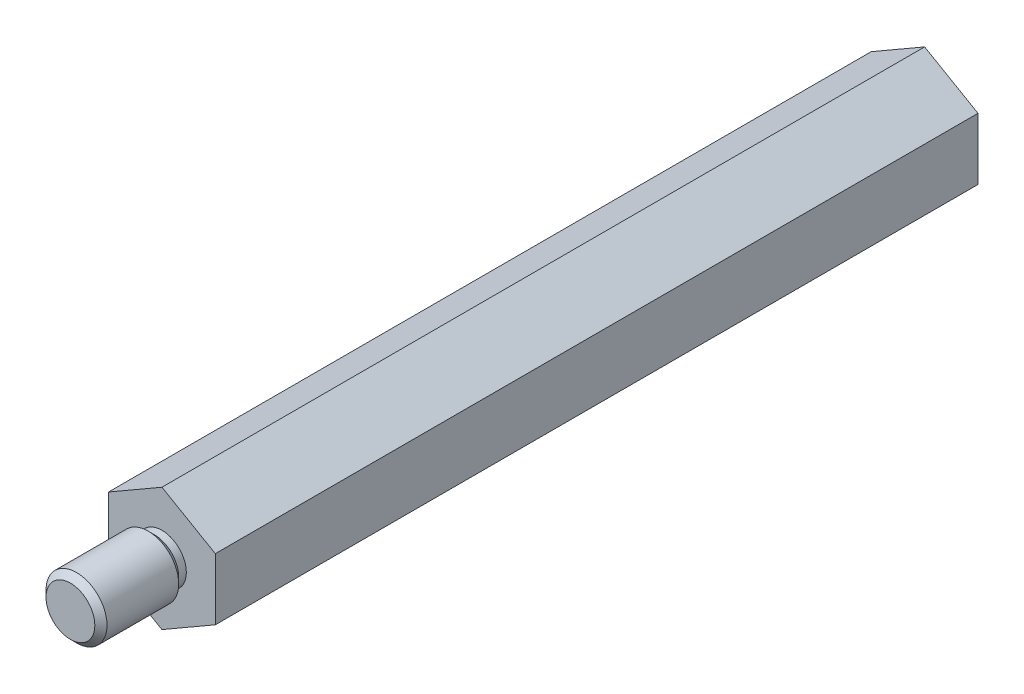
ISO-10303-21;
HEADER;
FILE_DESCRIPTION(('STEP AP214'),'2;1');
FILE_NAME('part.step','',(''),(''),'','','');
FILE_SCHEMA(('AUTOMOTIVE_DESIGN { 1 0 10303 214 1 1 1 1 }'));
ENDSEC;
DATA;
#1=APPLICATION_CONTEXT('core data for automotive mechanical design processes');
#2=APPLICATION_PROTOCOL_DEFINITION('international standard','automotive_design',2000,#1);
#3=PRODUCT_CONTEXT('',#1,'mechanical');
#4=PRODUCT('Part','Part','',(#3));
#5=PRODUCT_RELATED_PRODUCT_CATEGORY('part','',(#4));
#6=PRODUCT_DEFINITION_FORMATION('','',#4);
#7=PRODUCT_DEFINITION_CONTEXT('part definition',#1,'design');
#8=PRODUCT_DEFINITION('design','',#6,#7);
#9=PRODUCT_DEFINITION_SHAPE('','',#8);
#10=(LENGTH_UNIT() NAMED_UNIT(*) SI_UNIT(.MILLI.,.METRE.));
#11=(NAMED_UNIT(*) PLANE_ANGLE_UNIT() SI_UNIT($,.RADIAN.));
#12=(NAMED_UNIT(*) SI_UNIT($,.STERADIAN.) SOLID_ANGLE_UNIT());
#13=UNCERTAINTY_MEASURE_WITH_UNIT(LENGTH_MEASURE(1.E-05),#10,'distance_accuracy_value','');
#14=(GEOMETRIC_REPRESENTATION_CONTEXT(3) GLOBAL_UNCERTAINTY_ASSIGNED_CONTEXT((#13)) GLOBAL_UNIT_ASSIGNED_CONTEXT((#10,
#11,#12)) REPRESENTATION_CONTEXT('',''));
#15=CARTESIAN_POINT('',(0.,0.,0.));
#16=DIRECTION('',(0.,0.,1.));
#17=DIRECTION('',(1.,0.,0.));
#18=AXIS2_PLACEMENT_3D('',#15,#16,#17);
#19=CARTESIAN_POINT('',(0.,4.04145188432737,50.));
#20=DIRECTION('',(0.,0.,1.));
#21=DIRECTION('',(1.,0.,0.));
#22=AXIS2_PLACEMENT_3D('',#19,#20,#21);
#23=PLANE('',#22);
#24=DIRECTION('',(-0.866025403784438,0.5,0.));
#25=VECTOR('',#24,1.);
#26=CARTESIAN_POINT('',(3.49999999999999,2.02072594216368,50.));
#27=LINE('',#26,#25);
#28=CARTESIAN_POINT('',(3.49999999999999,2.02072594216368,50.));
#29=VERTEX_POINT('',#28);
#30=CARTESIAN_POINT('',(0.,4.04145188432737,50.));
#31=VERTEX_POINT('',#30);
#32=EDGE_CURVE('E130',#29,#31,#27,.T.);
#33=ORIENTED_EDGE('',*,*,#32,.T.);
#34=DIRECTION('',(-0.866025403784438,-0.5,0.));
#35=VECTOR('',#34,1.);
#36=CARTESIAN_POINT('',(0.,4.04145188432737,50.));
#37=LINE('',#36,#35);
#38=CARTESIAN_POINT('',(-3.5,2.02072594216368,50.));
#39=VERTEX_POINT('',#38);
#40=EDGE_CURVE('E87',#31,#39,#37,.T.);
#41=ORIENTED_EDGE('',*,*,#40,.T.);
#42=DIRECTION('',(0.,-1.,0.));
#43=VECTOR('',#42,1.);
#44=CARTESIAN_POINT('',(-3.5,2.02072594216368,50.));
#45=LINE('',#44,#43);
#46=CARTESIAN_POINT('',(-3.5,-2.0207259421637,50.));
#47=VERTEX_POINT('',#46);
#48=EDGE_CURVE('E101',#39,#47,#45,.T.);
#49=ORIENTED_EDGE('',*,*,#48,.T.);
#50=DIRECTION('',(0.866025403784438,-0.5,0.));
#51=VECTOR('',#50,1.);
#52=CARTESIAN_POINT('',(-3.5,-2.0207259421637,50.));
#53=LINE('',#52,#51);
#54=CARTESIAN_POINT('',(0.,-4.04145188432739,50.));
#55=VERTEX_POINT('',#54);
#56=EDGE_CURVE('E95',#47,#55,#53,.T.);
#57=ORIENTED_EDGE('',*,*,#56,.T.);
#58=DIRECTION('',(0.866025403784439,0.5,0.));
#59=VECTOR('',#58,1.);
#60=CARTESIAN_POINT('',(0.,-4.04145188432739,50.));
#61=LINE('',#60,#59);
#62=CARTESIAN_POINT('',(3.49999999999999,-2.0207259421637,50.));
#63=VERTEX_POINT('',#62);
#64=EDGE_CURVE('E99',#55,#63,#61,.T.);
#65=ORIENTED_EDGE('',*,*,#64,.T.);
#66=DIRECTION('',(0.,1.,0.));
#67=VECTOR('',#66,1.);
#68=CARTESIAN_POINT('',(3.49999999999999,-2.0207259421637,50.));
#69=LINE('',#68,#67);
#70=EDGE_CURVE('E48',#63,#29,#69,.T.);
#71=ORIENTED_EDGE('',*,*,#70,.T.);
#72=EDGE_LOOP('',(#33,#41,#49,#57,#65,#71));
#73=FACE_BOUND('',#72,.T.);
#74=CARTESIAN_POINT('',(0.,0.,50.));
#75=DIRECTION('',(0.,0.,1.));
#76=DIRECTION('',(1.,0.,0.));
#77=AXIS2_PLACEMENT_3D('',#74,#75,#76);
#78=CIRCLE('',#77,1.6);
#79=CARTESIAN_POINT('',(1.6,0.,50.));
#80=VERTEX_POINT('',#79);
#81=EDGE_CURVE('E197',#80,#80,#78,.T.);
#82=ORIENTED_EDGE('',*,*,#81,.F.);
#83=EDGE_LOOP('',(#82));
#84=FACE_BOUND('',#83,.T.);
#85=ADVANCED_FACE('F31',(#73,#84),#23,.T.);
#86=CARTESIAN_POINT('',(3.49999999999999,2.02072594216368,50.));
#87=DIRECTION('',(-0.5,-0.866025403784438,0.));
#88=DIRECTION('',(0.866025403784438,-0.5,0.));
#89=AXIS2_PLACEMENT_3D('',#86,#87,#88);
#90=PLANE('',#89);
#91=DIRECTION('',(-0.866025403784438,0.5,0.));
#92=VECTOR('',#91,1.);
#93=CARTESIAN_POINT('',(3.49999999999999,2.02072594216368,0.));
#94=LINE('',#93,#92);
#95=CARTESIAN_POINT('',(3.49999999999999,2.02072594216368,0.));
#96=VERTEX_POINT('',#95);
#97=CARTESIAN_POINT('',(0.,4.04145188432737,0.));
#98=VERTEX_POINT('',#97);
#99=EDGE_CURVE('E119',#96,#98,#94,.T.);
#100=ORIENTED_EDGE('',*,*,#99,.T.);
#101=DIRECTION('',(0.,0.,-1.));
#102=VECTOR('',#101,1.);
#103=CARTESIAN_POINT('',(0.,4.04145188432737,50.));
#104=LINE('',#103,#102);
#105=EDGE_CURVE('E137',#31,#98,#104,.T.);
#106=ORIENTED_EDGE('',*,*,#105,.F.);
#107=ORIENTED_EDGE('',*,*,#32,.F.);
#108=DIRECTION('',(0.,0.,-1.));
#109=VECTOR('',#108,1.);
#110=CARTESIAN_POINT('',(3.49999999999999,2.02072594216368,50.));
#111=LINE('',#110,#109);
#112=EDGE_CURVE('E115',#29,#96,#111,.T.);
#113=ORIENTED_EDGE('',*,*,#112,.T.);
#114=EDGE_LOOP('',(#100,#106,#107,#113));
#115=FACE_BOUND('',#114,.T.);
#116=ADVANCED_FACE('F161',(#115),#90,.F.);
#117=CARTESIAN_POINT('',(0.,4.04145188432737,50.));
#118=DIRECTION('',(0.5,-0.866025403784438,0.));
#119=DIRECTION('',(0.866025403784438,0.5,0.));
#120=AXIS2_PLACEMENT_3D('',#117,#118,#119);
#121=PLANE('',#120);
#122=DIRECTION('',(-0.866025403784438,-0.5,0.));
#123=VECTOR('',#122,1.);
#124=CARTESIAN_POINT('',(0.,4.04145188432737,0.));
#125=LINE('',#124,#123);
#126=CARTESIAN_POINT('',(-3.5,2.02072594216368,0.));
#127=VERTEX_POINT('',#126);
#128=EDGE_CURVE('E122',#98,#127,#125,.T.);
#129=ORIENTED_EDGE('',*,*,#128,.T.);
#130=DIRECTION('',(0.,0.,-1.));
#131=VECTOR('',#130,1.);
#132=CARTESIAN_POINT('',(-3.5,2.02072594216368,50.));
#133=LINE('',#132,#131);
#134=EDGE_CURVE('E134',#39,#127,#133,.T.);
#135=ORIENTED_EDGE('',*,*,#134,.F.);
#136=ORIENTED_EDGE('',*,*,#40,.F.);
#137=ORIENTED_EDGE('',*,*,#105,.T.);
#138=EDGE_LOOP('',(#129,#135,#136,#137));
#139=FACE_BOUND('',#138,.T.);
#140=ADVANCED_FACE('F166',(#139),#121,.F.);
#141=CARTESIAN_POINT('',(-3.5,2.02072594216368,50.));
#142=DIRECTION('',(1.,0.,0.));
#143=DIRECTION('',(0.,0.,-1.));
#144=AXIS2_PLACEMENT_3D('',#141,#142,#143);
#145=PLANE('',#144);
#146=DIRECTION('',(0.,-1.,0.));
#147=VECTOR('',#146,1.);
#148=CARTESIAN_POINT('',(-3.5,2.02072594216368,0.));
#149=LINE('',#148,#147);
#150=CARTESIAN_POINT('',(-3.5,-2.0207259421637,0.));
#151=VERTEX_POINT('',#150);
#152=EDGE_CURVE('E125',#127,#151,#149,.T.);
#153=ORIENTED_EDGE('',*,*,#152,.T.);
#154=DIRECTION('',(0.,0.,-1.));
#155=VECTOR('',#154,1.);
#156=CARTESIAN_POINT('',(-3.5,-2.0207259421637,50.));
#157=LINE('',#156,#155);
#158=EDGE_CURVE('E110',#47,#151,#157,.T.);
#159=ORIENTED_EDGE('',*,*,#158,.F.);
#160=ORIENTED_EDGE('',*,*,#48,.F.);
#161=ORIENTED_EDGE('',*,*,#134,.T.);
#162=EDGE_LOOP('',(#153,#159,#160,#161));
#163=FACE_BOUND('',#162,.T.);
#164=ADVANCED_FACE('F182',(#163),#145,.F.);
#165=CARTESIAN_POINT('',(-3.5,-2.0207259421637,50.));
#166=DIRECTION('',(0.5,0.866025403784438,0.));
#167=DIRECTION('',(-0.866025403784439,0.5,0.));
#168=AXIS2_PLACEMENT_3D('',#165,#166,#167);
#169=PLANE('',#168);
#170=DIRECTION('',(0.866025403784438,-0.5,0.));
#171=VECTOR('',#170,1.);
#172=CARTESIAN_POINT('',(-3.5,-2.0207259421637,0.));
#173=LINE('',#172,#171);
#174=CARTESIAN_POINT('',(0.,-4.04145188432739,0.));
#175=VERTEX_POINT('',#174);
#176=EDGE_CURVE('E109',#151,#175,#173,.T.);
#177=ORIENTED_EDGE('',*,*,#176,.T.);
#178=DIRECTION('',(0.,0.,-1.));
#179=VECTOR('',#178,1.);
#180=CARTESIAN_POINT('',(0.,-4.04145188432739,50.));
#181=LINE('',#180,#179);
#182=EDGE_CURVE('E106',#55,#175,#181,.T.);
#183=ORIENTED_EDGE('',*,*,#182,.F.);
#184=ORIENTED_EDGE('',*,*,#56,.F.);
#185=ORIENTED_EDGE('',*,*,#158,.T.);
#186=EDGE_LOOP('',(#177,#183,#184,#185));
#187=FACE_BOUND('',#186,.T.);
#188=ADVANCED_FACE('F107',(#187),#169,.F.);
#189=CARTESIAN_POINT('',(0.,-4.04145188432739,50.));
#190=DIRECTION('',(-0.5,0.866025403784439,0.));
#191=DIRECTION('',(-0.866025403784439,-0.5,0.));
#192=AXIS2_PLACEMENT_3D('',#189,#190,#191);
#193=PLANE('',#192);
#194=DIRECTION('',(0.866025403784439,0.5,0.));
#195=VECTOR('',#194,1.);
#196=CARTESIAN_POINT('',(0.,-4.04145188432739,0.));
#197=LINE('',#196,#195);
#198=CARTESIAN_POINT('',(3.49999999999999,-2.0207259421637,0.));
#199=VERTEX_POINT('',#198);
#200=EDGE_CURVE('E72',#175,#199,#197,.T.);
#201=ORIENTED_EDGE('',*,*,#200,.T.);
#202=DIRECTION('',(0.,0.,-1.));
#203=VECTOR('',#202,1.);
#204=CARTESIAN_POINT('',(3.49999999999999,-2.0207259421637,50.));
#205=LINE('',#204,#203);
#206=EDGE_CURVE('E111',#63,#199,#205,.T.);
#207=ORIENTED_EDGE('',*,*,#206,.F.);
#208=ORIENTED_EDGE('',*,*,#64,.F.);
#209=ORIENTED_EDGE('',*,*,#182,.T.);
#210=EDGE_LOOP('',(#201,#207,#208,#209));
#211=FACE_BOUND('',#210,.T.);
#212=ADVANCED_FACE('F113',(#211),#193,.F.);
#213=CARTESIAN_POINT('',(3.49999999999999,-2.0207259421637,50.));
#214=DIRECTION('',(-1.,0.,0.));
#215=DIRECTION('',(0.,-1.,0.));
#216=AXIS2_PLACEMENT_3D('',#213,#214,#215);
#217=PLANE('',#216);
#218=DIRECTION('',(0.,1.,0.));
#219=VECTOR('',#218,1.);
#220=CARTESIAN_POINT('',(3.49999999999999,-2.0207259421637,0.));
#221=LINE('',#220,#219);
#222=EDGE_CURVE('E78',#199,#96,#221,.T.);
#223=ORIENTED_EDGE('',*,*,#222,.T.);
#224=ORIENTED_EDGE('',*,*,#112,.F.);
#225=ORIENTED_EDGE('',*,*,#70,.F.);
#226=ORIENTED_EDGE('',*,*,#206,.T.);
#227=EDGE_LOOP('',(#223,#224,#225,#226));
#228=FACE_BOUND('',#227,.T.);
#229=ADVANCED_FACE('F174',(#228),#217,.F.);
#230=CARTESIAN_POINT('',(0.,4.04145188432737,0.));
#231=DIRECTION('',(0.,0.,1.));
#232=DIRECTION('',(1.,0.,0.));
#233=AXIS2_PLACEMENT_3D('',#230,#231,#232);
#234=PLANE('',#233);
#235=CARTESIAN_POINT('',(0.,0.,0.));
#236=DIRECTION('',(0.,0.,-1.));
#237=DIRECTION('',(-1.,0.,0.));
#238=AXIS2_PLACEMENT_3D('',#235,#236,#237);
#239=CIRCLE('',#238,1.5);
#240=CARTESIAN_POINT('',(-1.5,0.,0.));
#241=VERTEX_POINT('',#240);
#242=EDGE_CURVE('E207',#241,#241,#239,.T.);
#243=ORIENTED_EDGE('',*,*,#242,.F.);
#244=EDGE_LOOP('',(#243));
#245=FACE_BOUND('',#244,.T.);
#246=ORIENTED_EDGE('',*,*,#99,.F.);
#247=ORIENTED_EDGE('',*,*,#222,.F.);
#248=ORIENTED_EDGE('',*,*,#200,.F.);
#249=ORIENTED_EDGE('',*,*,#176,.F.);
#250=ORIENTED_EDGE('',*,*,#152,.F.);
#251=ORIENTED_EDGE('',*,*,#128,.F.);
#252=EDGE_LOOP('',(#246,#247,#248,#249,#250,#251));
#253=FACE_BOUND('',#252,.T.);
#254=ADVANCED_FACE('F170',(#245,#253),#234,.F.);
#255=CARTESIAN_POINT('',(0.,0.,50.5));
#256=DIRECTION('',(0.,0.,-1.));
#257=DIRECTION('',(-1.,0.,0.));
#258=AXIS2_PLACEMENT_3D('',#255,#256,#257);
#259=CYLINDRICAL_SURFACE('',#258,1.6);
#260=CARTESIAN_POINT('',(0.,0.,50.5));
#261=DIRECTION('',(0.,0.,1.));
#262=DIRECTION('',(1.,0.,0.));
#263=AXIS2_PLACEMENT_3D('',#260,#261,#262);
#264=CIRCLE('',#263,1.6);
#265=CARTESIAN_POINT('',(1.6,0.,50.5));
#266=VERTEX_POINT('',#265);
#267=EDGE_CURVE('E123',#266,#266,#264,.T.);
#268=ORIENTED_EDGE('',*,*,#267,.F.);
#269=EDGE_LOOP('',(#268));
#270=FACE_BOUND('',#269,.T.);
#271=ORIENTED_EDGE('',*,*,#81,.T.);
#272=EDGE_LOOP('',(#271));
#273=FACE_BOUND('',#272,.T.);
#274=ADVANCED_FACE('F173',(#270,#273),#259,.T.);
#275=CARTESIAN_POINT('',(0.,0.,56.));
#276=DIRECTION('',(0.,0.,1.));
#277=DIRECTION('',(1.,0.,0.));
#278=AXIS2_PLACEMENT_3D('',#275,#276,#277);
#279=PLANE('',#278);
#280=CARTESIAN_POINT('',(0.,0.,56.));
#281=DIRECTION('',(0.,0.,1.));
#282=DIRECTION('',(1.,0.,0.));
#283=AXIS2_PLACEMENT_3D('',#280,#281,#282);
#284=CIRCLE('',#283,1.6);
#285=CARTESIAN_POINT('',(1.6,0.,56.));
#286=VERTEX_POINT('',#285);
#287=EDGE_CURVE('E11',#286,#286,#284,.T.);
#288=ORIENTED_EDGE('',*,*,#287,.T.);
#289=EDGE_LOOP('',(#288));
#290=FACE_BOUND('',#289,.T.);
#291=ADVANCED_FACE('F156',(#290),#279,.T.);
#292=CARTESIAN_POINT('',(0.,0.,56.));
#293=DIRECTION('',(0.,0.,-1.));
#294=DIRECTION('',(-1.,0.,0.));
#295=AXIS2_PLACEMENT_3D('',#292,#293,#294);
#296=CYLINDRICAL_SURFACE('',#295,2.);
#297=CARTESIAN_POINT('',(0.,0.,50.9));
#298=DIRECTION('',(0.,0.,1.));
#299=DIRECTION('',(1.,0.,0.));
#300=AXIS2_PLACEMENT_3D('',#297,#298,#299);
#301=CIRCLE('',#300,2.);
#302=CARTESIAN_POINT('',(2.,0.,50.9));
#303=VERTEX_POINT('',#302);
#304=EDGE_CURVE('E40',#303,#303,#301,.T.);
#305=ORIENTED_EDGE('',*,*,#304,.T.);
#306=EDGE_LOOP('',(#305));
#307=FACE_BOUND('',#306,.T.);
#308=CARTESIAN_POINT('',(0.,0.,55.6));
#309=DIRECTION('',(0.,0.,1.));
#310=DIRECTION('',(1.,0.,0.));
#311=AXIS2_PLACEMENT_3D('',#308,#309,#310);
#312=CIRCLE('',#311,2.);
#313=CARTESIAN_POINT('',(2.,0.,55.6));
#314=VERTEX_POINT('',#313);
#315=EDGE_CURVE('E139',#314,#314,#312,.F.);
#316=ORIENTED_EDGE('',*,*,#315,.T.);
#317=EDGE_LOOP('',(#316));
#318=FACE_BOUND('',#317,.T.);
#319=ADVANCED_FACE('F144',(#307,#318),#296,.T.);
#320=CARTESIAN_POINT('',(0.,0.,50.9));
#321=DIRECTION('',(0.,0.,1.));
#322=DIRECTION('',(1.,0.,0.));
#323=AXIS2_PLACEMENT_3D('',#320,#321,#322);
#324=CONICAL_SURFACE('',#323,2.,0.785398163397443);
#325=ORIENTED_EDGE('',*,*,#267,.T.);
#326=EDGE_LOOP('',(#325));
#327=FACE_BOUND('',#326,.T.);
#328=ORIENTED_EDGE('',*,*,#304,.F.);
#329=EDGE_LOOP('',(#328));
#330=FACE_BOUND('',#329,.T.);
#331=ADVANCED_FACE('F147',(#327,#330),#324,.T.);
#332=CARTESIAN_POINT('',(0.,0.,56.));
#333=DIRECTION('',(0.,0.,-1.));
#334=DIRECTION('',(-1.,0.,0.));
#335=AXIS2_PLACEMENT_3D('',#332,#333,#334);
#336=CONICAL_SURFACE('',#335,1.6,0.78539816339744);
#337=ORIENTED_EDGE('',*,*,#315,.F.);
#338=EDGE_LOOP('',(#337));
#339=FACE_BOUND('',#338,.T.);
#340=ORIENTED_EDGE('',*,*,#287,.F.);
#341=EDGE_LOOP('',(#340));
#342=FACE_BOUND('',#341,.T.);
#343=ADVANCED_FACE('F33',(#339,#342),#336,.T.);
#344=CARTESIAN_POINT('',(0.,0.,8.));
#345=DIRECTION('',(0.,0.,-1.));
#346=DIRECTION('',(-1.,0.,0.));
#347=AXIS2_PLACEMENT_3D('',#344,#345,#346);
#348=CONICAL_SURFACE('',#347,1.1,1.02974425867665);
#349=CARTESIAN_POINT('',(0.,0.,8.66094668093032));
#350=VERTEX_POINT('',#349);
#351=VERTEX_LOOP('',#350);
#352=FACE_BOUND('',#351,.T.);
#353=CARTESIAN_POINT('',(0.,0.,8.));
#354=DIRECTION('',(0.,0.,-1.));
#355=DIRECTION('',(-1.,0.,0.));
#356=AXIS2_PLACEMENT_3D('',#353,#354,#355);
#357=CIRCLE('',#356,1.1);
#358=CARTESIAN_POINT('',(-1.1,0.,8.));
#359=VERTEX_POINT('',#358);
#360=EDGE_CURVE('E200',#359,#359,#357,.T.);
#361=ORIENTED_EDGE('',*,*,#360,.T.);
#362=EDGE_LOOP('',(#361));
#363=FACE_BOUND('',#362,.T.);
#364=ADVANCED_FACE('F154',(#352,#363),#348,.F.);
#365=CARTESIAN_POINT('',(0.,0.,0.));
#366=DIRECTION('',(0.,0.,-1.));
#367=DIRECTION('',(-1.,0.,0.));
#368=AXIS2_PLACEMENT_3D('',#365,#366,#367);
#369=CYLINDRICAL_SURFACE('',#368,1.1);
#370=ORIENTED_EDGE('',*,*,#360,.F.);
#371=EDGE_LOOP('',(#370));
#372=FACE_BOUND('',#371,.T.);
#373=CARTESIAN_POINT('',(0.,0.,0.400000000000001));
#374=DIRECTION('',(0.,0.,-1.));
#375=DIRECTION('',(-1.,0.,0.));
#376=AXIS2_PLACEMENT_3D('',#373,#374,#375);
#377=CIRCLE('',#376,1.1);
#378=CARTESIAN_POINT('',(-1.1,0.,0.400000000000001));
#379=VERTEX_POINT('',#378);
#380=EDGE_CURVE('E204',#379,#379,#377,.T.);
#381=ORIENTED_EDGE('',*,*,#380,.T.);
#382=EDGE_LOOP('',(#381));
#383=FACE_BOUND('',#382,.T.);
#384=ADVANCED_FACE('F213',(#372,#383),#369,.F.);
#385=CARTESIAN_POINT('',(0.,0.,0.));
#386=DIRECTION('',(0.,0.,-1.));
#387=DIRECTION('',(-1.,0.,0.));
#388=AXIS2_PLACEMENT_3D('',#385,#386,#387);
#389=CONICAL_SURFACE('',#388,1.5,0.785398163397449);
#390=ORIENTED_EDGE('',*,*,#380,.F.);
#391=EDGE_LOOP('',(#390));
#392=FACE_BOUND('',#391,.T.);
#393=ORIENTED_EDGE('',*,*,#242,.T.);
#394=EDGE_LOOP('',(#393));
#395=FACE_BOUND('',#394,.T.);
#396=ADVANCED_FACE('F211',(#392,#395),#389,.F.);
#397=CLOSED_SHELL('',(#85,#116,#140,#164,#188,#212,#229,#254,#274,#291,#319,#331,#343,#364,#384,#396));
#398=MANIFOLD_SOLID_BREP('B2',#397);
#399=ADVANCED_BREP_SHAPE_REPRESENTATION('',(#18,#398),#14);
#400=SHAPE_DEFINITION_REPRESENTATION(#9,#399);
ENDSEC;
END-ISO-10303-21;
